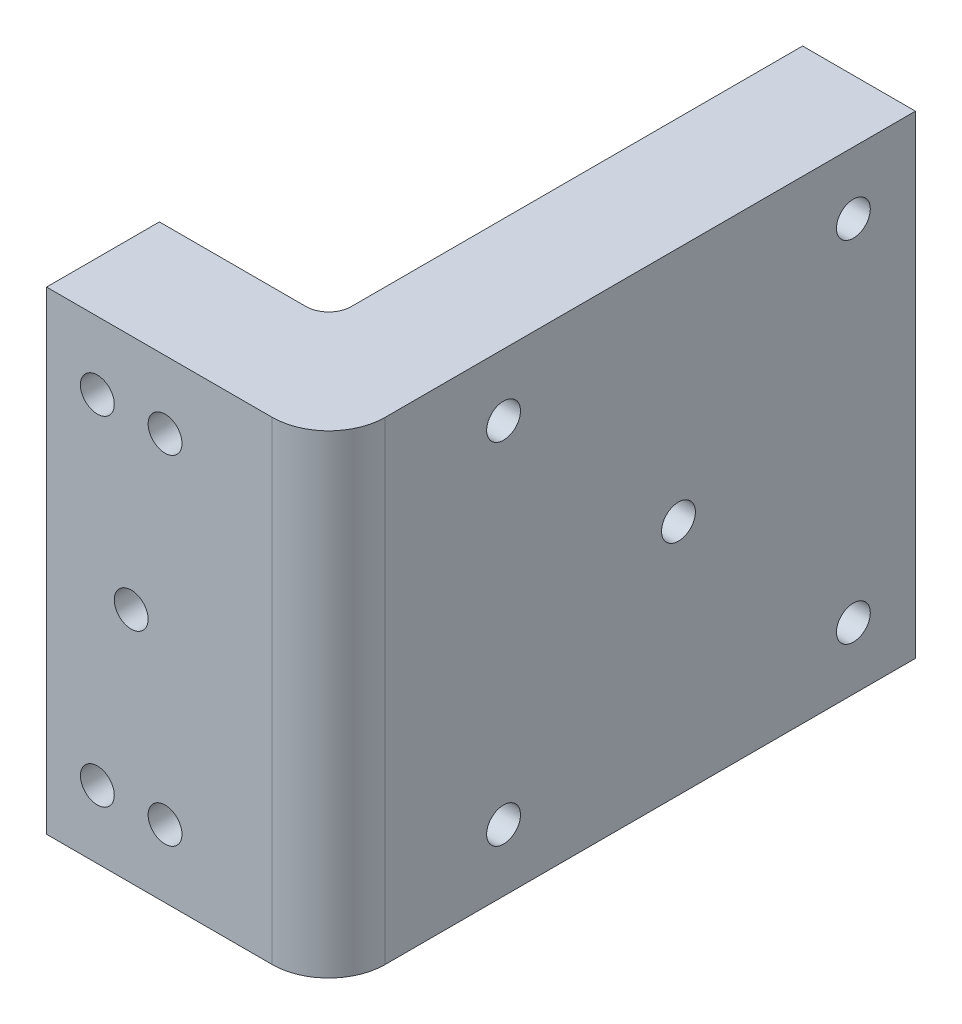
ISO-10303-21;
HEADER;
FILE_DESCRIPTION(('STEP AP214'),'2;1');
FILE_NAME('part.step','',(''),(''),'','','');
FILE_SCHEMA(('AUTOMOTIVE_DESIGN { 1 0 10303 214 1 1 1 1 }'));
ENDSEC;
DATA;
#1=APPLICATION_CONTEXT('core data for automotive mechanical design processes');
#2=APPLICATION_PROTOCOL_DEFINITION('international standard','automotive_design',2000,#1);
#3=PRODUCT_CONTEXT('',#1,'mechanical');
#4=PRODUCT('Part','Part','',(#3));
#5=PRODUCT_RELATED_PRODUCT_CATEGORY('part','',(#4));
#6=PRODUCT_DEFINITION_FORMATION('','',#4);
#7=PRODUCT_DEFINITION_CONTEXT('part definition',#1,'design');
#8=PRODUCT_DEFINITION('design','',#6,#7);
#9=PRODUCT_DEFINITION_SHAPE('','',#8);
#10=(LENGTH_UNIT() NAMED_UNIT(*) SI_UNIT(.MILLI.,.METRE.));
#11=(NAMED_UNIT(*) PLANE_ANGLE_UNIT() SI_UNIT($,.RADIAN.));
#12=(NAMED_UNIT(*) SI_UNIT($,.STERADIAN.) SOLID_ANGLE_UNIT());
#13=UNCERTAINTY_MEASURE_WITH_UNIT(LENGTH_MEASURE(1.E-05),#10,'distance_accuracy_value','');
#14=(GEOMETRIC_REPRESENTATION_CONTEXT(3) GLOBAL_UNCERTAINTY_ASSIGNED_CONTEXT((#13)) GLOBAL_UNIT_ASSIGNED_CONTEXT((#10,
#11,#12)) REPRESENTATION_CONTEXT('',''));
#15=CARTESIAN_POINT('',(0.,0.,0.));
#16=DIRECTION('',(0.,0.,1.));
#17=DIRECTION('',(1.,0.,0.));
#18=AXIS2_PLACEMENT_3D('',#15,#16,#17);
#19=CARTESIAN_POINT('',(0.,-21.,10.));
#20=DIRECTION('',(0.,1.,0.));
#21=DIRECTION('',(0.,0.,1.));
#22=AXIS2_PLACEMENT_3D('',#19,#20,#21);
#23=PLANE('',#22);
#24=DIRECTION('',(0.,0.,-1.));
#25=VECTOR('',#24,1.);
#26=CARTESIAN_POINT('',(17.5,-21.,10.));
#27=LINE('',#26,#25);
#28=CARTESIAN_POINT('',(17.5,-21.,5.));
#29=VERTEX_POINT('',#28);
#30=CARTESIAN_POINT('',(17.5,-21.,-42.));
#31=VERTEX_POINT('',#30);
#32=EDGE_CURVE('E192',#29,#31,#27,.T.);
#33=ORIENTED_EDGE('',*,*,#32,.F.);
#34=CARTESIAN_POINT('',(12.5,-21.,5.));
#35=DIRECTION('',(0.,1.,0.));
#36=DIRECTION('',(0.,0.,1.));
#37=AXIS2_PLACEMENT_3D('',#34,#35,#36);
#38=CIRCLE('',#37,5.);
#39=CARTESIAN_POINT('',(12.5,-21.,10.));
#40=VERTEX_POINT('',#39);
#41=EDGE_CURVE('E63',#29,#40,#38,.F.);
#42=ORIENTED_EDGE('',*,*,#41,.T.);
#43=DIRECTION('',(1.,0.,0.));
#44=VECTOR('',#43,1.);
#45=CARTESIAN_POINT('',(0.,-21.,10.));
#46=LINE('',#45,#44);
#47=CARTESIAN_POINT('',(-7.5,-21.,10.));
#48=VERTEX_POINT('',#47);
#49=EDGE_CURVE('E159',#48,#40,#46,.T.);
#50=ORIENTED_EDGE('',*,*,#49,.F.);
#51=DIRECTION('',(0.,0.,-1.));
#52=VECTOR('',#51,1.);
#53=CARTESIAN_POINT('',(-7.5,-21.,10.));
#54=LINE('',#53,#52);
#55=CARTESIAN_POINT('',(-7.5,-21.,0.));
#56=VERTEX_POINT('',#55);
#57=EDGE_CURVE('E165',#48,#56,#54,.T.);
#58=ORIENTED_EDGE('',*,*,#57,.T.);
#59=DIRECTION('',(1.,0.,0.));
#60=VECTOR('',#59,1.);
#61=CARTESIAN_POINT('',(0.,-21.,0.));
#62=LINE('',#61,#60);
#63=CARTESIAN_POINT('',(5.5,-21.,0.));
#64=VERTEX_POINT('',#63);
#65=EDGE_CURVE('E180',#56,#64,#62,.T.);
#66=ORIENTED_EDGE('',*,*,#65,.T.);
#67=CARTESIAN_POINT('',(5.5,-21.,-2.));
#68=DIRECTION('',(0.,1.,0.));
#69=DIRECTION('',(0.,0.,1.));
#70=AXIS2_PLACEMENT_3D('',#67,#68,#69);
#71=CIRCLE('',#70,2.);
#72=CARTESIAN_POINT('',(7.5,-21.,-2.00000000000002));
#73=VERTEX_POINT('',#72);
#74=EDGE_CURVE('E198',#64,#73,#71,.T.);
#75=ORIENTED_EDGE('',*,*,#74,.T.);
#76=DIRECTION('',(0.,0.,1.));
#77=VECTOR('',#76,1.);
#78=CARTESIAN_POINT('',(7.5,-21.,-42.));
#79=LINE('',#78,#77);
#80=CARTESIAN_POINT('',(7.5,-21.,-42.));
#81=VERTEX_POINT('',#80);
#82=EDGE_CURVE('E117',#81,#73,#79,.T.);
#83=ORIENTED_EDGE('',*,*,#82,.F.);
#84=DIRECTION('',(-1.,0.,0.));
#85=VECTOR('',#84,1.);
#86=CARTESIAN_POINT('',(0.,-21.,-42.));
#87=LINE('',#86,#85);
#88=EDGE_CURVE('E131',#31,#81,#87,.T.);
#89=ORIENTED_EDGE('',*,*,#88,.F.);
#90=EDGE_LOOP('',(#33,#42,#50,#58,#66,#75,#83,#89));
#91=FACE_BOUND('',#90,.T.);
#92=ADVANCED_FACE('F41',(#91),#23,.F.);
#93=CARTESIAN_POINT('',(17.5,0.,10.));
#94=DIRECTION('',(1.,0.,0.));
#95=DIRECTION('',(0.,1.,0.));
#96=AXIS2_PLACEMENT_3D('',#93,#94,#95);
#97=PLANE('',#96);
#98=CARTESIAN_POINT('',(17.5,15.5,-5.5));
#99=DIRECTION('',(1.,0.,0.));
#100=DIRECTION('',(0.,1.,0.));
#101=AXIS2_PLACEMENT_3D('',#98,#99,#100);
#102=CIRCLE('',#101,1.5);
#103=CARTESIAN_POINT('',(17.5,17.,-5.5));
#104=VERTEX_POINT('',#103);
#105=EDGE_CURVE('E133',#104,#104,#102,.T.);
#106=ORIENTED_EDGE('',*,*,#105,.F.);
#107=EDGE_LOOP('',(#106));
#108=FACE_BOUND('',#107,.T.);
#109=CARTESIAN_POINT('',(17.5,-15.5,-36.5));
#110=DIRECTION('',(1.,0.,0.));
#111=DIRECTION('',(0.,1.,0.));
#112=AXIS2_PLACEMENT_3D('',#109,#110,#111);
#113=CIRCLE('',#112,1.5);
#114=CARTESIAN_POINT('',(17.5,-14.,-36.5));
#115=VERTEX_POINT('',#114);
#116=EDGE_CURVE('E136',#115,#115,#113,.T.);
#117=ORIENTED_EDGE('',*,*,#116,.F.);
#118=EDGE_LOOP('',(#117));
#119=FACE_BOUND('',#118,.T.);
#120=CARTESIAN_POINT('',(17.5,-15.5,-5.5));
#121=DIRECTION('',(1.,0.,0.));
#122=DIRECTION('',(0.,1.,0.));
#123=AXIS2_PLACEMENT_3D('',#120,#121,#122);
#124=CIRCLE('',#123,1.5);
#125=CARTESIAN_POINT('',(17.5,-14.,-5.5));
#126=VERTEX_POINT('',#125);
#127=EDGE_CURVE('E488',#126,#126,#124,.T.);
#128=ORIENTED_EDGE('',*,*,#127,.F.);
#129=EDGE_LOOP('',(#128));
#130=FACE_BOUND('',#129,.T.);
#131=CARTESIAN_POINT('',(17.5,0.,-21.));
#132=DIRECTION('',(1.,0.,0.));
#133=DIRECTION('',(0.,1.,0.));
#134=AXIS2_PLACEMENT_3D('',#131,#132,#133);
#135=CIRCLE('',#134,1.5);
#136=CARTESIAN_POINT('',(17.5,1.5,-21.));
#137=VERTEX_POINT('',#136);
#138=EDGE_CURVE('E485',#137,#137,#135,.T.);
#139=ORIENTED_EDGE('',*,*,#138,.F.);
#140=EDGE_LOOP('',(#139));
#141=FACE_BOUND('',#140,.T.);
#142=CARTESIAN_POINT('',(17.5,15.5,-36.5));
#143=DIRECTION('',(1.,0.,0.));
#144=DIRECTION('',(0.,1.,0.));
#145=AXIS2_PLACEMENT_3D('',#142,#143,#144);
#146=CIRCLE('',#145,1.5);
#147=CARTESIAN_POINT('',(17.5,17.,-36.5));
#148=VERTEX_POINT('',#147);
#149=EDGE_CURVE('E474',#148,#148,#146,.T.);
#150=ORIENTED_EDGE('',*,*,#149,.F.);
#151=EDGE_LOOP('',(#150));
#152=FACE_BOUND('',#151,.T.);
#153=DIRECTION('',(0.,0.,-1.));
#154=VECTOR('',#153,1.);
#155=CARTESIAN_POINT('',(17.5,21.,10.));
#156=LINE('',#155,#154);
#157=CARTESIAN_POINT('',(17.5,21.,5.));
#158=VERTEX_POINT('',#157);
#159=CARTESIAN_POINT('',(17.5,21.,-42.));
#160=VERTEX_POINT('',#159);
#161=EDGE_CURVE('E123',#158,#160,#156,.T.);
#162=ORIENTED_EDGE('',*,*,#161,.F.);
#163=DIRECTION('',(0.,-1.,0.));
#164=VECTOR('',#163,1.);
#165=CARTESIAN_POINT('',(17.5,0.,5.));
#166=LINE('',#165,#164);
#167=EDGE_CURVE('E202',#158,#29,#166,.T.);
#168=ORIENTED_EDGE('',*,*,#167,.T.);
#169=ORIENTED_EDGE('',*,*,#32,.T.);
#170=DIRECTION('',(0.,-1.,0.));
#171=VECTOR('',#170,1.);
#172=CARTESIAN_POINT('',(17.5,0.,-42.));
#173=LINE('',#172,#171);
#174=EDGE_CURVE('E127',#160,#31,#173,.T.);
#175=ORIENTED_EDGE('',*,*,#174,.F.);
#176=EDGE_LOOP('',(#162,#168,#169,#175));
#177=FACE_BOUND('',#176,.T.);
#178=ADVANCED_FACE('F207',(#108,#119,#130,#141,#152,#177),#97,.T.);
#179=CARTESIAN_POINT('',(0.,21.,10.));
#180=DIRECTION('',(0.,1.,0.));
#181=DIRECTION('',(0.,0.,1.));
#182=AXIS2_PLACEMENT_3D('',#179,#180,#181);
#183=PLANE('',#182);
#184=DIRECTION('',(1.,0.,0.));
#185=VECTOR('',#184,1.);
#186=CARTESIAN_POINT('',(0.,21.,10.));
#187=LINE('',#186,#185);
#188=CARTESIAN_POINT('',(-7.5,21.,10.));
#189=VERTEX_POINT('',#188);
#190=CARTESIAN_POINT('',(12.5,21.,10.));
#191=VERTEX_POINT('',#190);
#192=EDGE_CURVE('E161',#189,#191,#187,.T.);
#193=ORIENTED_EDGE('',*,*,#192,.T.);
#194=CARTESIAN_POINT('',(12.5,21.,5.));
#195=DIRECTION('',(0.,1.,0.));
#196=DIRECTION('',(0.,0.,1.));
#197=AXIS2_PLACEMENT_3D('',#194,#195,#196);
#198=CIRCLE('',#197,5.);
#199=EDGE_CURVE('E11',#191,#158,#198,.T.);
#200=ORIENTED_EDGE('',*,*,#199,.T.);
#201=ORIENTED_EDGE('',*,*,#161,.T.);
#202=DIRECTION('',(1.,0.,0.));
#203=VECTOR('',#202,1.);
#204=CARTESIAN_POINT('',(0.,21.,-42.));
#205=LINE('',#204,#203);
#206=CARTESIAN_POINT('',(7.5,21.,-42.));
#207=VERTEX_POINT('',#206);
#208=EDGE_CURVE('E120',#207,#160,#205,.T.);
#209=ORIENTED_EDGE('',*,*,#208,.F.);
#210=DIRECTION('',(0.,0.,1.));
#211=VECTOR('',#210,1.);
#212=CARTESIAN_POINT('',(7.5,21.,-42.));
#213=LINE('',#212,#211);
#214=CARTESIAN_POINT('',(7.5,21.,-2.00000000000002));
#215=VERTEX_POINT('',#214);
#216=EDGE_CURVE('E106',#207,#215,#213,.T.);
#217=ORIENTED_EDGE('',*,*,#216,.T.);
#218=CARTESIAN_POINT('',(5.5,21.,-2.));
#219=DIRECTION('',(0.,1.,0.));
#220=DIRECTION('',(0.,0.,1.));
#221=AXIS2_PLACEMENT_3D('',#218,#219,#220);
#222=CIRCLE('',#221,2.);
#223=CARTESIAN_POINT('',(5.5,21.,0.));
#224=VERTEX_POINT('',#223);
#225=EDGE_CURVE('E200',#215,#224,#222,.F.);
#226=ORIENTED_EDGE('',*,*,#225,.T.);
#227=DIRECTION('',(1.,0.,0.));
#228=VECTOR('',#227,1.);
#229=CARTESIAN_POINT('',(0.,21.,0.));
#230=LINE('',#229,#228);
#231=CARTESIAN_POINT('',(-7.5,21.,0.));
#232=VERTEX_POINT('',#231);
#233=EDGE_CURVE('E183',#232,#224,#230,.T.);
#234=ORIENTED_EDGE('',*,*,#233,.F.);
#235=DIRECTION('',(0.,0.,-1.));
#236=VECTOR('',#235,1.);
#237=CARTESIAN_POINT('',(-7.5,21.,10.));
#238=LINE('',#237,#236);
#239=EDGE_CURVE('E189',#189,#232,#238,.T.);
#240=ORIENTED_EDGE('',*,*,#239,.F.);
#241=EDGE_LOOP('',(#193,#200,#201,#209,#217,#226,#234,#240));
#242=FACE_BOUND('',#241,.T.);
#243=ADVANCED_FACE('F121',(#242),#183,.T.);
#244=CARTESIAN_POINT('',(-3.,15.,10.));
#245=DIRECTION('',(0.,0.,-1.));
#246=DIRECTION('',(-1.,0.,0.));
#247=AXIS2_PLACEMENT_3D('',#244,#245,#246);
#248=CYLINDRICAL_SURFACE('',#247,1.5);
#249=CARTESIAN_POINT('',(-3.,15.,10.));
#250=DIRECTION('',(0.,0.,1.));
#251=DIRECTION('',(1.,0.,0.));
#252=AXIS2_PLACEMENT_3D('',#249,#250,#251);
#253=CIRCLE('',#252,1.5);
#254=CARTESIAN_POINT('',(-1.5,15.,10.));
#255=VERTEX_POINT('',#254);
#256=EDGE_CURVE('E156',#255,#255,#253,.T.);
#257=ORIENTED_EDGE('',*,*,#256,.T.);
#258=EDGE_LOOP('',(#257));
#259=FACE_BOUND('',#258,.T.);
#260=CARTESIAN_POINT('',(-3.,15.,0.));
#261=DIRECTION('',(0.,0.,1.));
#262=DIRECTION('',(1.,0.,0.));
#263=AXIS2_PLACEMENT_3D('',#260,#261,#262);
#264=CIRCLE('',#263,1.5);
#265=CARTESIAN_POINT('',(-1.5,15.,0.));
#266=VERTEX_POINT('',#265);
#267=EDGE_CURVE('E177',#266,#266,#264,.T.);
#268=ORIENTED_EDGE('',*,*,#267,.F.);
#269=EDGE_LOOP('',(#268));
#270=FACE_BOUND('',#269,.T.);
#271=ADVANCED_FACE('F237',(#259,#270),#248,.F.);
#272=CARTESIAN_POINT('',(-3.,-15.,10.));
#273=DIRECTION('',(0.,0.,-1.));
#274=DIRECTION('',(-1.,0.,0.));
#275=AXIS2_PLACEMENT_3D('',#272,#273,#274);
#276=CYLINDRICAL_SURFACE('',#275,1.5);
#277=CARTESIAN_POINT('',(-3.,-15.,10.));
#278=DIRECTION('',(0.,0.,1.));
#279=DIRECTION('',(1.,0.,0.));
#280=AXIS2_PLACEMENT_3D('',#277,#278,#279);
#281=CIRCLE('',#280,1.5);
#282=CARTESIAN_POINT('',(-1.5,-15.,10.));
#283=VERTEX_POINT('',#282);
#284=EDGE_CURVE('E153',#283,#283,#281,.T.);
#285=ORIENTED_EDGE('',*,*,#284,.T.);
#286=EDGE_LOOP('',(#285));
#287=FACE_BOUND('',#286,.T.);
#288=CARTESIAN_POINT('',(-3.,-15.,0.));
#289=DIRECTION('',(0.,0.,1.));
#290=DIRECTION('',(1.,0.,0.));
#291=AXIS2_PLACEMENT_3D('',#288,#289,#290);
#292=CIRCLE('',#291,1.5);
#293=CARTESIAN_POINT('',(-1.5,-15.,0.));
#294=VERTEX_POINT('',#293);
#295=EDGE_CURVE('E174',#294,#294,#292,.T.);
#296=ORIENTED_EDGE('',*,*,#295,.F.);
#297=EDGE_LOOP('',(#296));
#298=FACE_BOUND('',#297,.T.);
#299=ADVANCED_FACE('F240',(#287,#298),#276,.F.);
#300=CARTESIAN_POINT('',(3.,15.,10.));
#301=DIRECTION('',(0.,0.,-1.));
#302=DIRECTION('',(-1.,0.,0.));
#303=AXIS2_PLACEMENT_3D('',#300,#301,#302);
#304=CYLINDRICAL_SURFACE('',#303,1.5);
#305=CARTESIAN_POINT('',(3.,15.,10.));
#306=DIRECTION('',(0.,0.,1.));
#307=DIRECTION('',(1.,0.,0.));
#308=AXIS2_PLACEMENT_3D('',#305,#306,#307);
#309=CIRCLE('',#308,1.5);
#310=CARTESIAN_POINT('',(4.5,15.,10.));
#311=VERTEX_POINT('',#310);
#312=EDGE_CURVE('E150',#311,#311,#309,.T.);
#313=ORIENTED_EDGE('',*,*,#312,.T.);
#314=EDGE_LOOP('',(#313));
#315=FACE_BOUND('',#314,.T.);
#316=CARTESIAN_POINT('',(3.,15.,0.));
#317=DIRECTION('',(0.,0.,1.));
#318=DIRECTION('',(1.,0.,0.));
#319=AXIS2_PLACEMENT_3D('',#316,#317,#318);
#320=CIRCLE('',#319,1.5);
#321=CARTESIAN_POINT('',(4.5,15.,0.));
#322=VERTEX_POINT('',#321);
#323=EDGE_CURVE('E171',#322,#322,#320,.T.);
#324=ORIENTED_EDGE('',*,*,#323,.F.);
#325=EDGE_LOOP('',(#324));
#326=FACE_BOUND('',#325,.T.);
#327=ADVANCED_FACE('F244',(#315,#326),#304,.F.);
#328=CARTESIAN_POINT('',(3.,-15.,10.));
#329=DIRECTION('',(0.,0.,-1.));
#330=DIRECTION('',(-1.,0.,0.));
#331=AXIS2_PLACEMENT_3D('',#328,#329,#330);
#332=CYLINDRICAL_SURFACE('',#331,1.5);
#333=CARTESIAN_POINT('',(3.,-15.,10.));
#334=DIRECTION('',(0.,0.,1.));
#335=DIRECTION('',(1.,0.,0.));
#336=AXIS2_PLACEMENT_3D('',#333,#334,#335);
#337=CIRCLE('',#336,1.5);
#338=CARTESIAN_POINT('',(4.5,-15.,10.));
#339=VERTEX_POINT('',#338);
#340=EDGE_CURVE('E146',#339,#339,#337,.T.);
#341=ORIENTED_EDGE('',*,*,#340,.T.);
#342=EDGE_LOOP('',(#341));
#343=FACE_BOUND('',#342,.T.);
#344=CARTESIAN_POINT('',(3.,-15.,0.));
#345=DIRECTION('',(0.,0.,1.));
#346=DIRECTION('',(1.,0.,0.));
#347=AXIS2_PLACEMENT_3D('',#344,#345,#346);
#348=CIRCLE('',#347,1.5);
#349=CARTESIAN_POINT('',(4.5,-15.,0.));
#350=VERTEX_POINT('',#349);
#351=EDGE_CURVE('E168',#350,#350,#348,.T.);
#352=ORIENTED_EDGE('',*,*,#351,.F.);
#353=EDGE_LOOP('',(#352));
#354=FACE_BOUND('',#353,.T.);
#355=ADVANCED_FACE('F248',(#343,#354),#332,.F.);
#356=CARTESIAN_POINT('',(0.,0.,10.));
#357=DIRECTION('',(0.,0.,-1.));
#358=DIRECTION('',(-1.,0.,0.));
#359=AXIS2_PLACEMENT_3D('',#356,#357,#358);
#360=CYLINDRICAL_SURFACE('',#359,1.5);
#361=CARTESIAN_POINT('',(0.,0.,10.));
#362=DIRECTION('',(0.,0.,1.));
#363=DIRECTION('',(1.,0.,0.));
#364=AXIS2_PLACEMENT_3D('',#361,#362,#363);
#365=CIRCLE('',#364,1.5);
#366=CARTESIAN_POINT('',(1.5,0.,10.));
#367=VERTEX_POINT('',#366);
#368=EDGE_CURVE('E143',#367,#367,#365,.T.);
#369=ORIENTED_EDGE('',*,*,#368,.T.);
#370=EDGE_LOOP('',(#369));
#371=FACE_BOUND('',#370,.T.);
#372=CARTESIAN_POINT('',(0.,0.,0.));
#373=DIRECTION('',(0.,0.,1.));
#374=DIRECTION('',(1.,0.,0.));
#375=AXIS2_PLACEMENT_3D('',#372,#373,#374);
#376=CIRCLE('',#375,1.5);
#377=CARTESIAN_POINT('',(1.5,0.,0.));
#378=VERTEX_POINT('',#377);
#379=EDGE_CURVE('E116',#378,#378,#376,.T.);
#380=ORIENTED_EDGE('',*,*,#379,.F.);
#381=EDGE_LOOP('',(#380));
#382=FACE_BOUND('',#381,.T.);
#383=ADVANCED_FACE('F252',(#371,#382),#360,.F.);
#384=CARTESIAN_POINT('',(-7.5,0.,10.));
#385=DIRECTION('',(1.,0.,0.));
#386=DIRECTION('',(0.,1.,0.));
#387=AXIS2_PLACEMENT_3D('',#384,#385,#386);
#388=PLANE('',#387);
#389=DIRECTION('',(0.,-1.,0.));
#390=VECTOR('',#389,1.);
#391=CARTESIAN_POINT('',(-7.5,0.,0.));
#392=LINE('',#391,#390);
#393=EDGE_CURVE('E147',#232,#56,#392,.T.);
#394=ORIENTED_EDGE('',*,*,#393,.T.);
#395=ORIENTED_EDGE('',*,*,#57,.F.);
#396=DIRECTION('',(0.,-1.,0.));
#397=VECTOR('',#396,1.);
#398=CARTESIAN_POINT('',(-7.5,0.,10.));
#399=LINE('',#398,#397);
#400=EDGE_CURVE('E163',#189,#48,#399,.T.);
#401=ORIENTED_EDGE('',*,*,#400,.F.);
#402=ORIENTED_EDGE('',*,*,#239,.T.);
#403=EDGE_LOOP('',(#394,#395,#401,#402));
#404=FACE_BOUND('',#403,.T.);
#405=ADVANCED_FACE('F220',(#404),#388,.F.);
#406=CARTESIAN_POINT('',(0.,0.,10.));
#407=DIRECTION('',(0.,0.,1.));
#408=DIRECTION('',(1.,0.,0.));
#409=AXIS2_PLACEMENT_3D('',#406,#407,#408);
#410=PLANE('',#409);
#411=ORIENTED_EDGE('',*,*,#368,.F.);
#412=EDGE_LOOP('',(#411));
#413=FACE_BOUND('',#412,.T.);
#414=ORIENTED_EDGE('',*,*,#340,.F.);
#415=EDGE_LOOP('',(#414));
#416=FACE_BOUND('',#415,.T.);
#417=ORIENTED_EDGE('',*,*,#312,.F.);
#418=EDGE_LOOP('',(#417));
#419=FACE_BOUND('',#418,.T.);
#420=ORIENTED_EDGE('',*,*,#284,.F.);
#421=EDGE_LOOP('',(#420));
#422=FACE_BOUND('',#421,.T.);
#423=ORIENTED_EDGE('',*,*,#256,.F.);
#424=EDGE_LOOP('',(#423));
#425=FACE_BOUND('',#424,.T.);
#426=ORIENTED_EDGE('',*,*,#49,.T.);
#427=DIRECTION('',(0.,-1.,0.));
#428=VECTOR('',#427,1.);
#429=CARTESIAN_POINT('',(12.5,0.,10.));
#430=LINE('',#429,#428);
#431=EDGE_CURVE('E49',#40,#191,#430,.F.);
#432=ORIENTED_EDGE('',*,*,#431,.T.);
#433=ORIENTED_EDGE('',*,*,#192,.F.);
#434=ORIENTED_EDGE('',*,*,#400,.T.);
#435=EDGE_LOOP('',(#426,#432,#433,#434));
#436=FACE_BOUND('',#435,.T.);
#437=ADVANCED_FACE('F222',(#413,#416,#419,#422,#425,#436),#410,.T.);
#438=CARTESIAN_POINT('',(0.,0.,0.));
#439=DIRECTION('',(0.,0.,1.));
#440=DIRECTION('',(1.,0.,0.));
#441=AXIS2_PLACEMENT_3D('',#438,#439,#440);
#442=PLANE('',#441);
#443=ORIENTED_EDGE('',*,*,#379,.T.);
#444=EDGE_LOOP('',(#443));
#445=FACE_BOUND('',#444,.T.);
#446=ORIENTED_EDGE('',*,*,#351,.T.);
#447=EDGE_LOOP('',(#446));
#448=FACE_BOUND('',#447,.T.);
#449=ORIENTED_EDGE('',*,*,#323,.T.);
#450=EDGE_LOOP('',(#449));
#451=FACE_BOUND('',#450,.T.);
#452=ORIENTED_EDGE('',*,*,#295,.T.);
#453=EDGE_LOOP('',(#452));
#454=FACE_BOUND('',#453,.T.);
#455=ORIENTED_EDGE('',*,*,#267,.T.);
#456=EDGE_LOOP('',(#455));
#457=FACE_BOUND('',#456,.T.);
#458=ORIENTED_EDGE('',*,*,#233,.T.);
#459=DIRECTION('',(0.,-1.,0.));
#460=VECTOR('',#459,1.);
#461=CARTESIAN_POINT('',(5.5,0.,0.));
#462=LINE('',#461,#460);
#463=EDGE_CURVE('E194',#224,#64,#462,.T.);
#464=ORIENTED_EDGE('',*,*,#463,.T.);
#465=ORIENTED_EDGE('',*,*,#65,.F.);
#466=ORIENTED_EDGE('',*,*,#393,.F.);
#467=EDGE_LOOP('',(#458,#464,#465,#466));
#468=FACE_BOUND('',#467,.T.);
#469=ADVANCED_FACE('F216',(#445,#448,#451,#454,#457,#468),#442,.F.);
#470=CARTESIAN_POINT('',(7.5,0.,-42.));
#471=DIRECTION('',(-1.,0.,0.));
#472=DIRECTION('',(0.,-1.,0.));
#473=AXIS2_PLACEMENT_3D('',#470,#471,#472);
#474=PLANE('',#473);
#475=CARTESIAN_POINT('',(7.5,15.5,-5.5));
#476=DIRECTION('',(-1.,0.,0.));
#477=DIRECTION('',(0.,-1.,0.));
#478=AXIS2_PLACEMENT_3D('',#475,#476,#477);
#479=CIRCLE('',#478,1.5);
#480=CARTESIAN_POINT('',(7.5,14.,-5.5));
#481=VERTEX_POINT('',#480);
#482=EDGE_CURVE('E469',#481,#481,#479,.T.);
#483=ORIENTED_EDGE('',*,*,#482,.F.);
#484=EDGE_LOOP('',(#483));
#485=FACE_BOUND('',#484,.T.);
#486=CARTESIAN_POINT('',(7.5,-15.5,-36.5));
#487=DIRECTION('',(-1.,0.,0.));
#488=DIRECTION('',(0.,-1.,0.));
#489=AXIS2_PLACEMENT_3D('',#486,#487,#488);
#490=CIRCLE('',#489,1.5);
#491=CARTESIAN_POINT('',(7.5,-17.,-36.5));
#492=VERTEX_POINT('',#491);
#493=EDGE_CURVE('E471',#492,#492,#490,.T.);
#494=ORIENTED_EDGE('',*,*,#493,.F.);
#495=EDGE_LOOP('',(#494));
#496=FACE_BOUND('',#495,.T.);
#497=CARTESIAN_POINT('',(7.5,-15.5,-5.5));
#498=DIRECTION('',(-1.,0.,0.));
#499=DIRECTION('',(0.,-1.,0.));
#500=AXIS2_PLACEMENT_3D('',#497,#498,#499);
#501=CIRCLE('',#500,1.5);
#502=CARTESIAN_POINT('',(7.5,-17.,-5.5));
#503=VERTEX_POINT('',#502);
#504=EDGE_CURVE('E477',#503,#503,#501,.T.);
#505=ORIENTED_EDGE('',*,*,#504,.F.);
#506=EDGE_LOOP('',(#505));
#507=FACE_BOUND('',#506,.T.);
#508=CARTESIAN_POINT('',(7.5,0.,-21.));
#509=DIRECTION('',(-1.,0.,0.));
#510=DIRECTION('',(0.,-1.,0.));
#511=AXIS2_PLACEMENT_3D('',#508,#509,#510);
#512=CIRCLE('',#511,1.5);
#513=CARTESIAN_POINT('',(7.5,-1.5,-21.));
#514=VERTEX_POINT('',#513);
#515=EDGE_CURVE('E480',#514,#514,#512,.T.);
#516=ORIENTED_EDGE('',*,*,#515,.F.);
#517=EDGE_LOOP('',(#516));
#518=FACE_BOUND('',#517,.T.);
#519=CARTESIAN_POINT('',(7.5,15.5,-36.5));
#520=DIRECTION('',(-1.,0.,0.));
#521=DIRECTION('',(0.,-1.,0.));
#522=AXIS2_PLACEMENT_3D('',#519,#520,#521);
#523=CIRCLE('',#522,1.5);
#524=CARTESIAN_POINT('',(7.5,14.,-36.5));
#525=VERTEX_POINT('',#524);
#526=EDGE_CURVE('E470',#525,#525,#523,.T.);
#527=ORIENTED_EDGE('',*,*,#526,.F.);
#528=EDGE_LOOP('',(#527));
#529=FACE_BOUND('',#528,.T.);
#530=ORIENTED_EDGE('',*,*,#82,.T.);
#531=DIRECTION('',(0.,-1.,0.));
#532=VECTOR('',#531,1.);
#533=CARTESIAN_POINT('',(7.5,0.,-2.));
#534=LINE('',#533,#532);
#535=EDGE_CURVE('E113',#73,#215,#534,.F.);
#536=ORIENTED_EDGE('',*,*,#535,.T.);
#537=ORIENTED_EDGE('',*,*,#216,.F.);
#538=DIRECTION('',(0.,-1.,0.));
#539=VECTOR('',#538,1.);
#540=CARTESIAN_POINT('',(7.5,0.,-42.));
#541=LINE('',#540,#539);
#542=EDGE_CURVE('E111',#207,#81,#541,.T.);
#543=ORIENTED_EDGE('',*,*,#542,.T.);
#544=EDGE_LOOP('',(#530,#536,#537,#543));
#545=FACE_BOUND('',#544,.T.);
#546=ADVANCED_FACE('F109',(#485,#496,#507,#518,#529,#545),#474,.T.);
#547=CARTESIAN_POINT('',(0.,0.,-42.));
#548=DIRECTION('',(0.,0.,-1.));
#549=DIRECTION('',(-1.,0.,0.));
#550=AXIS2_PLACEMENT_3D('',#547,#548,#549);
#551=PLANE('',#550);
#552=ORIENTED_EDGE('',*,*,#542,.F.);
#553=ORIENTED_EDGE('',*,*,#208,.T.);
#554=ORIENTED_EDGE('',*,*,#174,.T.);
#555=ORIENTED_EDGE('',*,*,#88,.T.);
#556=EDGE_LOOP('',(#552,#553,#554,#555));
#557=FACE_BOUND('',#556,.T.);
#558=ADVANCED_FACE('F129',(#557),#551,.T.);
#559=CARTESIAN_POINT('',(22.5,15.5,-36.5));
#560=DIRECTION('',(-1.,0.,0.));
#561=DIRECTION('',(0.,-1.,0.));
#562=AXIS2_PLACEMENT_3D('',#559,#560,#561);
#563=CYLINDRICAL_SURFACE('',#562,1.5);
#564=ORIENTED_EDGE('',*,*,#149,.T.);
#565=EDGE_LOOP('',(#564));
#566=FACE_BOUND('',#565,.T.);
#567=ORIENTED_EDGE('',*,*,#526,.T.);
#568=EDGE_LOOP('',(#567));
#569=FACE_BOUND('',#568,.T.);
#570=ADVANCED_FACE('F328',(#566,#569),#563,.F.);
#571=CARTESIAN_POINT('',(22.5,0.,-21.));
#572=DIRECTION('',(-1.,0.,0.));
#573=DIRECTION('',(0.,-1.,0.));
#574=AXIS2_PLACEMENT_3D('',#571,#572,#573);
#575=CYLINDRICAL_SURFACE('',#574,1.5);
#576=ORIENTED_EDGE('',*,*,#138,.T.);
#577=EDGE_LOOP('',(#576));
#578=FACE_BOUND('',#577,.T.);
#579=ORIENTED_EDGE('',*,*,#515,.T.);
#580=EDGE_LOOP('',(#579));
#581=FACE_BOUND('',#580,.T.);
#582=ADVANCED_FACE('F338',(#578,#581),#575,.F.);
#583=CARTESIAN_POINT('',(22.5,-15.5,-5.5));
#584=DIRECTION('',(-1.,0.,0.));
#585=DIRECTION('',(0.,-1.,0.));
#586=AXIS2_PLACEMENT_3D('',#583,#584,#585);
#587=CYLINDRICAL_SURFACE('',#586,1.5);
#588=ORIENTED_EDGE('',*,*,#127,.T.);
#589=EDGE_LOOP('',(#588));
#590=FACE_BOUND('',#589,.T.);
#591=ORIENTED_EDGE('',*,*,#504,.T.);
#592=EDGE_LOOP('',(#591));
#593=FACE_BOUND('',#592,.T.);
#594=ADVANCED_FACE('F348',(#590,#593),#587,.F.);
#595=CARTESIAN_POINT('',(22.5,-15.5,-36.5));
#596=DIRECTION('',(-1.,0.,0.));
#597=DIRECTION('',(0.,-1.,0.));
#598=AXIS2_PLACEMENT_3D('',#595,#596,#597);
#599=CYLINDRICAL_SURFACE('',#598,1.5);
#600=ORIENTED_EDGE('',*,*,#116,.T.);
#601=EDGE_LOOP('',(#600));
#602=FACE_BOUND('',#601,.T.);
#603=ORIENTED_EDGE('',*,*,#493,.T.);
#604=EDGE_LOOP('',(#603));
#605=FACE_BOUND('',#604,.T.);
#606=ADVANCED_FACE('F358',(#602,#605),#599,.F.);
#607=CARTESIAN_POINT('',(22.5,15.5,-5.5));
#608=DIRECTION('',(-1.,0.,0.));
#609=DIRECTION('',(0.,-1.,0.));
#610=AXIS2_PLACEMENT_3D('',#607,#608,#609);
#611=CYLINDRICAL_SURFACE('',#610,1.5);
#612=ORIENTED_EDGE('',*,*,#105,.T.);
#613=EDGE_LOOP('',(#612));
#614=FACE_BOUND('',#613,.T.);
#615=ORIENTED_EDGE('',*,*,#482,.T.);
#616=EDGE_LOOP('',(#615));
#617=FACE_BOUND('',#616,.T.);
#618=ADVANCED_FACE('F227',(#614,#617),#611,.F.);
#619=CARTESIAN_POINT('',(5.5,0.,-2.));
#620=DIRECTION('',(0.,-1.,0.));
#621=DIRECTION('',(1.,0.,0.));
#622=AXIS2_PLACEMENT_3D('',#619,#620,#621);
#623=CYLINDRICAL_SURFACE('',#622,2.);
#624=ORIENTED_EDGE('',*,*,#225,.F.);
#625=ORIENTED_EDGE('',*,*,#535,.F.);
#626=ORIENTED_EDGE('',*,*,#74,.F.);
#627=ORIENTED_EDGE('',*,*,#463,.F.);
#628=EDGE_LOOP('',(#624,#625,#626,#627));
#629=FACE_BOUND('',#628,.T.);
#630=ADVANCED_FACE('F211',(#629),#623,.F.);
#631=CARTESIAN_POINT('',(12.5,0.,5.));
#632=DIRECTION('',(0.,-1.,0.));
#633=DIRECTION('',(1.,0.,0.));
#634=AXIS2_PLACEMENT_3D('',#631,#632,#633);
#635=CYLINDRICAL_SURFACE('',#634,5.);
#636=ORIENTED_EDGE('',*,*,#199,.F.);
#637=ORIENTED_EDGE('',*,*,#431,.F.);
#638=ORIENTED_EDGE('',*,*,#41,.F.);
#639=ORIENTED_EDGE('',*,*,#167,.F.);
#640=EDGE_LOOP('',(#636,#637,#638,#639));
#641=FACE_BOUND('',#640,.T.);
#642=ADVANCED_FACE('F43',(#641),#635,.T.);
#643=CLOSED_SHELL('',(#92,#178,#243,#271,#299,#327,#355,#383,#405,#437,#469,#546,#558,#570,#582,
#594,#606,#618,#630,#642));
#644=MANIFOLD_SOLID_BREP('B2',#643);
#645=ADVANCED_BREP_SHAPE_REPRESENTATION('',(#18,#644),#14);
#646=SHAPE_DEFINITION_REPRESENTATION(#9,#645);
ENDSEC;
END-ISO-10303-21;
